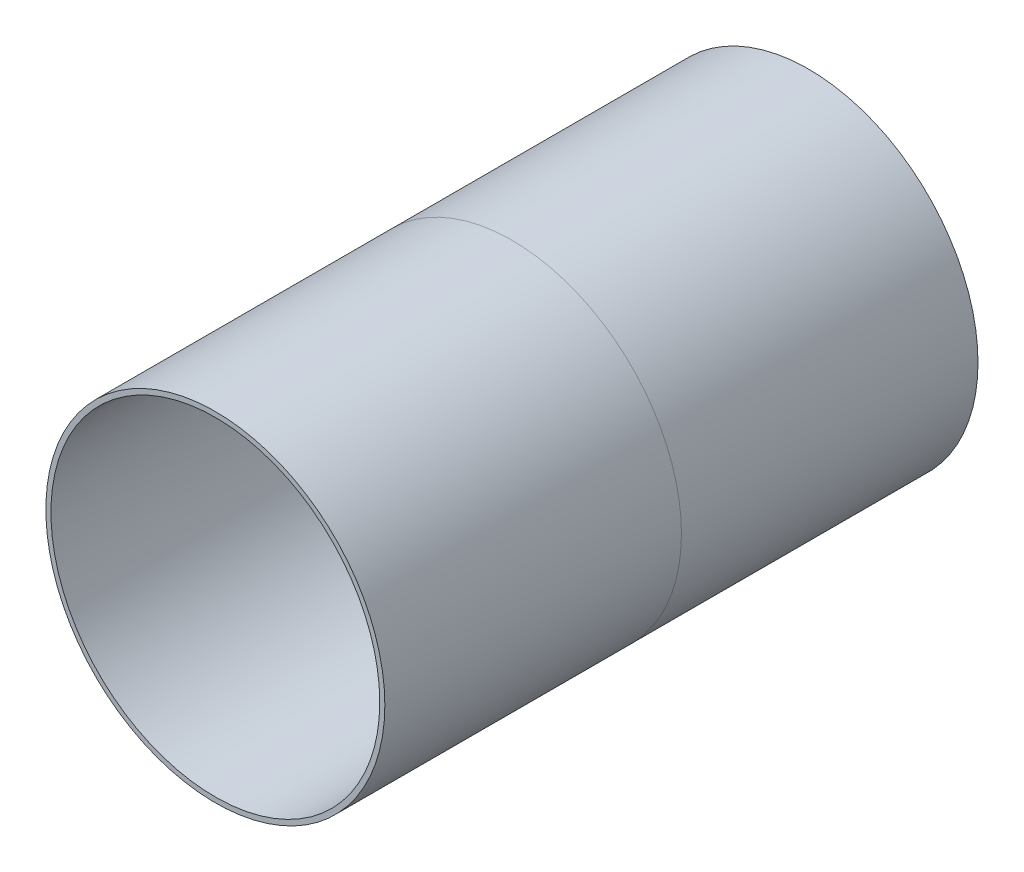
ISO-10303-21;
HEADER;
FILE_DESCRIPTION(('STEP AP214'),'2;1');
FILE_NAME('part.step','',(''),(''),'','','');
FILE_SCHEMA(('AUTOMOTIVE_DESIGN { 1 0 10303 214 1 1 1 1 }'));
ENDSEC;
DATA;
#1=APPLICATION_CONTEXT('core data for automotive mechanical design processes');
#2=APPLICATION_PROTOCOL_DEFINITION('international standard','automotive_design',2000,#1);
#3=PRODUCT_CONTEXT('',#1,'mechanical');
#4=PRODUCT('Part','Part','',(#3));
#5=PRODUCT_RELATED_PRODUCT_CATEGORY('part','',(#4));
#6=PRODUCT_DEFINITION_FORMATION('','',#4);
#7=PRODUCT_DEFINITION_CONTEXT('part definition',#1,'design');
#8=PRODUCT_DEFINITION('design','',#6,#7);
#9=PRODUCT_DEFINITION_SHAPE('','',#8);
#10=(LENGTH_UNIT() NAMED_UNIT(*) SI_UNIT(.MILLI.,.METRE.));
#11=(NAMED_UNIT(*) PLANE_ANGLE_UNIT() SI_UNIT($,.RADIAN.));
#12=(NAMED_UNIT(*) SI_UNIT($,.STERADIAN.) SOLID_ANGLE_UNIT());
#13=UNCERTAINTY_MEASURE_WITH_UNIT(LENGTH_MEASURE(1.E-05),#10,'distance_accuracy_value','');
#14=(GEOMETRIC_REPRESENTATION_CONTEXT(3) GLOBAL_UNCERTAINTY_ASSIGNED_CONTEXT((#13)) GLOBAL_UNIT_ASSIGNED_CONTEXT((#10,
#11,#12)) REPRESENTATION_CONTEXT('',''));
#15=CARTESIAN_POINT('',(0.,0.,0.));
#16=DIRECTION('',(0.,0.,1.));
#17=DIRECTION('',(1.,0.,0.));
#18=AXIS2_PLACEMENT_3D('',#15,#16,#17);
#19=CARTESIAN_POINT('',(0.,0.,0.));
#20=DIRECTION('',(0.,0.,1.));
#21=DIRECTION('',(1.,0.,0.));
#22=AXIS2_PLACEMENT_3D('',#19,#20,#21);
#23=PLANE('',#22);
#24=CARTESIAN_POINT('',(0.,0.,0.));
#25=DIRECTION('',(0.,0.,1.));
#26=DIRECTION('',(1.,0.,0.));
#27=AXIS2_PLACEMENT_3D('',#24,#25,#26);
#28=CIRCLE('',#27,76.1746);
#29=CARTESIAN_POINT('',(76.1746,0.,0.));
#30=VERTEX_POINT('',#29);
#31=EDGE_CURVE('E45',#30,#30,#28,.T.);
#32=ORIENTED_EDGE('',*,*,#31,.F.);
#33=EDGE_LOOP('',(#32));
#34=FACE_BOUND('',#33,.T.);
#35=CARTESIAN_POINT('',(0.,0.,0.));
#36=DIRECTION('',(0.,0.,1.));
#37=DIRECTION('',(1.,0.,0.));
#38=AXIS2_PLACEMENT_3D('',#35,#36,#37);
#39=CIRCLE('',#38,73.914);
#40=CARTESIAN_POINT('',(73.914,0.,0.));
#41=VERTEX_POINT('',#40);
#42=EDGE_CURVE('E52',#41,#41,#39,.T.);
#43=ORIENTED_EDGE('',*,*,#42,.T.);
#44=EDGE_LOOP('',(#43));
#45=FACE_BOUND('',#44,.T.);
#46=ADVANCED_FACE('F41',(#34,#45),#23,.F.);
#47=CARTESIAN_POINT('',(0.,0.,133.35));
#48=DIRECTION('',(0.,0.,-1.));
#49=DIRECTION('',(-1.,0.,0.));
#50=AXIS2_PLACEMENT_3D('',#47,#48,#49);
#51=CYLINDRICAL_SURFACE('',#50,76.1746);
#52=CARTESIAN_POINT('',(0.,0.,133.35));
#53=DIRECTION('',(0.,0.,1.));
#54=DIRECTION('',(1.,0.,0.));
#55=AXIS2_PLACEMENT_3D('',#52,#53,#54);
#56=CIRCLE('',#55,76.1746);
#57=CARTESIAN_POINT('',(76.1746,0.,133.35));
#58=VERTEX_POINT('',#57);
#59=EDGE_CURVE('E10',#58,#58,#56,.T.);
#60=ORIENTED_EDGE('',*,*,#59,.F.);
#61=EDGE_LOOP('',(#60));
#62=FACE_BOUND('',#61,.T.);
#63=ORIENTED_EDGE('',*,*,#31,.T.);
#64=EDGE_LOOP('',(#63));
#65=FACE_BOUND('',#64,.T.);
#66=ADVANCED_FACE('F43',(#62,#65),#51,.T.);
#67=CARTESIAN_POINT('',(0.,0.,133.35));
#68=DIRECTION('',(0.,0.,-1.));
#69=DIRECTION('',(-1.,0.,0.));
#70=AXIS2_PLACEMENT_3D('',#67,#68,#69);
#71=CYLINDRICAL_SURFACE('',#70,73.914);
#72=ORIENTED_EDGE('',*,*,#42,.F.);
#73=EDGE_LOOP('',(#72));
#74=FACE_BOUND('',#73,.T.);
#75=CARTESIAN_POINT('',(0.,0.,266.7));
#76=DIRECTION('',(0.,0.,1.));
#77=DIRECTION('',(1.,0.,0.));
#78=AXIS2_PLACEMENT_3D('',#75,#76,#77);
#79=CIRCLE('',#78,73.914);
#80=CARTESIAN_POINT('',(73.914,0.,266.7));
#81=VERTEX_POINT('',#80);
#82=EDGE_CURVE('E60',#81,#81,#79,.T.);
#83=ORIENTED_EDGE('',*,*,#82,.T.);
#84=EDGE_LOOP('',(#83));
#85=FACE_BOUND('',#84,.T.);
#86=ADVANCED_FACE('F66',(#74,#85),#71,.F.);
#87=CARTESIAN_POINT('',(0.,0.,266.7));
#88=DIRECTION('',(0.,0.,1.));
#89=DIRECTION('',(1.,0.,0.));
#90=AXIS2_PLACEMENT_3D('',#87,#88,#89);
#91=PLANE('',#90);
#92=CARTESIAN_POINT('',(0.,0.,266.7));
#93=DIRECTION('',(0.,0.,1.));
#94=DIRECTION('',(1.,0.,0.));
#95=AXIS2_PLACEMENT_3D('',#92,#93,#94);
#96=CIRCLE('',#95,76.2);
#97=CARTESIAN_POINT('',(76.2,0.,266.7));
#98=VERTEX_POINT('',#97);
#99=EDGE_CURVE('E56',#98,#98,#96,.T.);
#100=ORIENTED_EDGE('',*,*,#99,.T.);
#101=EDGE_LOOP('',(#100));
#102=FACE_BOUND('',#101,.T.);
#103=ORIENTED_EDGE('',*,*,#82,.F.);
#104=EDGE_LOOP('',(#103));
#105=FACE_BOUND('',#104,.T.);
#106=ADVANCED_FACE('F68',(#102,#105),#91,.T.);
#107=CARTESIAN_POINT('',(0.,0.,133.35));
#108=DIRECTION('',(0.,0.,1.));
#109=DIRECTION('',(1.,0.,0.));
#110=AXIS2_PLACEMENT_3D('',#107,#108,#109);
#111=PLANE('',#110);
#112=ORIENTED_EDGE('',*,*,#59,.T.);
#113=EDGE_LOOP('',(#112));
#114=FACE_BOUND('',#113,.T.);
#115=CARTESIAN_POINT('',(0.,0.,133.35));
#116=DIRECTION('',(0.,0.,1.));
#117=DIRECTION('',(1.,0.,0.));
#118=AXIS2_PLACEMENT_3D('',#115,#116,#117);
#119=CIRCLE('',#118,76.2);
#120=CARTESIAN_POINT('',(76.2,0.,133.35));
#121=VERTEX_POINT('',#120);
#122=EDGE_CURVE('E57',#121,#121,#119,.T.);
#123=ORIENTED_EDGE('',*,*,#122,.F.);
#124=EDGE_LOOP('',(#123));
#125=FACE_BOUND('',#124,.T.);
#126=ADVANCED_FACE('F70',(#114,#125),#111,.F.);
#127=CARTESIAN_POINT('',(0.,0.,266.7));
#128=DIRECTION('',(0.,0.,-1.));
#129=DIRECTION('',(-1.,0.,0.));
#130=AXIS2_PLACEMENT_3D('',#127,#128,#129);
#131=CYLINDRICAL_SURFACE('',#130,76.2);
#132=ORIENTED_EDGE('',*,*,#99,.F.);
#133=EDGE_LOOP('',(#132));
#134=FACE_BOUND('',#133,.T.);
#135=ORIENTED_EDGE('',*,*,#122,.T.);
#136=EDGE_LOOP('',(#135));
#137=FACE_BOUND('',#136,.T.);
#138=ADVANCED_FACE('F77',(#134,#137),#131,.T.);
#139=CLOSED_SHELL('',(#46,#66,#86,#106,#126,#138));
#140=MANIFOLD_SOLID_BREP('B2',#139);
#141=ADVANCED_BREP_SHAPE_REPRESENTATION('',(#18,#140),#14);
#142=SHAPE_DEFINITION_REPRESENTATION(#9,#141);
ENDSEC;
END-ISO-10303-21;
